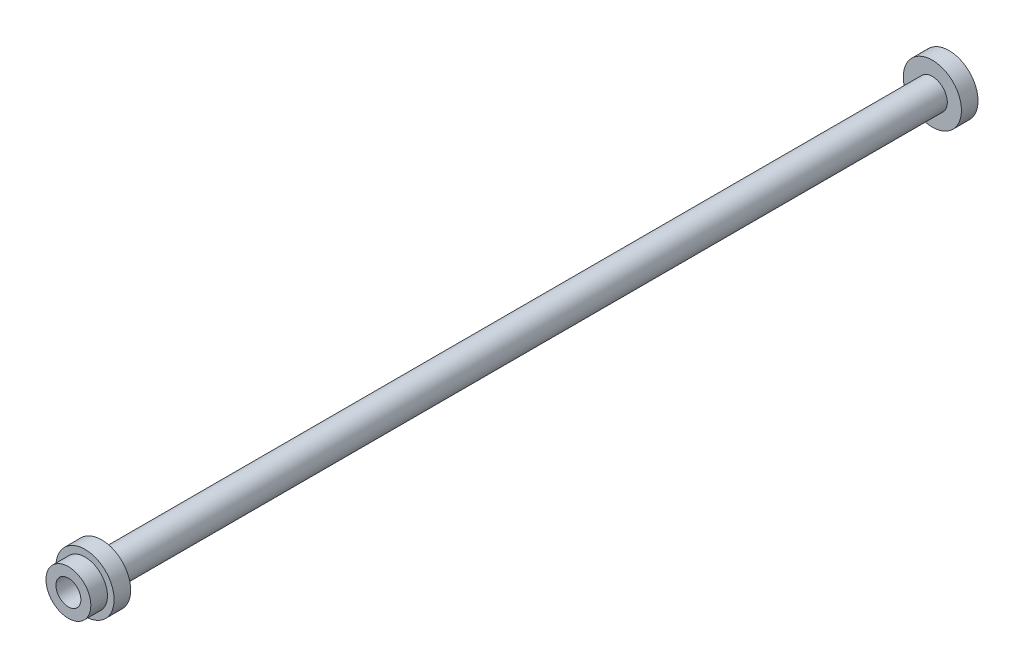
ISO-10303-21;
HEADER;
FILE_DESCRIPTION(('STEP AP214'),'2;1');
FILE_NAME('part.step','',(''),(''),'','','');
FILE_SCHEMA(('AUTOMOTIVE_DESIGN { 1 0 10303 214 1 1 1 1 }'));
ENDSEC;
DATA;
#1=APPLICATION_CONTEXT('core data for automotive mechanical design processes');
#2=APPLICATION_PROTOCOL_DEFINITION('international standard','automotive_design',2000,#1);
#3=PRODUCT_CONTEXT('',#1,'mechanical');
#4=PRODUCT('Part','Part','',(#3));
#5=PRODUCT_RELATED_PRODUCT_CATEGORY('part','',(#4));
#6=PRODUCT_DEFINITION_FORMATION('','',#4);
#7=PRODUCT_DEFINITION_CONTEXT('part definition',#1,'design');
#8=PRODUCT_DEFINITION('design','',#6,#7);
#9=PRODUCT_DEFINITION_SHAPE('','',#8);
#10=(LENGTH_UNIT() NAMED_UNIT(*) SI_UNIT(.MILLI.,.METRE.));
#11=(NAMED_UNIT(*) PLANE_ANGLE_UNIT() SI_UNIT($,.RADIAN.));
#12=(NAMED_UNIT(*) SI_UNIT($,.STERADIAN.) SOLID_ANGLE_UNIT());
#13=UNCERTAINTY_MEASURE_WITH_UNIT(LENGTH_MEASURE(1.E-05),#10,'distance_accuracy_value','');
#14=(GEOMETRIC_REPRESENTATION_CONTEXT(3) GLOBAL_UNCERTAINTY_ASSIGNED_CONTEXT((#13)) GLOBAL_UNIT_ASSIGNED_CONTEXT((#10,
#11,#12)) REPRESENTATION_CONTEXT('',''));
#15=CARTESIAN_POINT('',(0.,0.,0.));
#16=DIRECTION('',(0.,0.,1.));
#17=DIRECTION('',(1.,0.,0.));
#18=AXIS2_PLACEMENT_3D('',#15,#16,#17);
#19=CARTESIAN_POINT('',(0.,0.,530.));
#20=DIRECTION('',(0.,0.,1.));
#21=DIRECTION('',(1.,0.,0.));
#22=AXIS2_PLACEMENT_3D('',#19,#20,#21);
#23=PLANE('',#22);
#24=CARTESIAN_POINT('',(0.,0.,530.));
#25=DIRECTION('',(0.,0.,1.));
#26=DIRECTION('',(1.,0.,0.));
#27=AXIS2_PLACEMENT_3D('',#24,#25,#26);
#28=CIRCLE('',#27,7.50000000000001);
#29=CARTESIAN_POINT('',(7.50000000000001,0.,530.));
#30=VERTEX_POINT('',#29);
#31=EDGE_CURVE('E54',#30,#30,#28,.T.);
#32=ORIENTED_EDGE('',*,*,#31,.F.);
#33=EDGE_LOOP('',(#32));
#34=FACE_BOUND('',#33,.T.);
#35=CARTESIAN_POINT('',(0.,0.,530.));
#36=DIRECTION('',(0.,0.,1.));
#37=DIRECTION('',(1.,0.,0.));
#38=AXIS2_PLACEMENT_3D('',#35,#36,#37);
#39=CIRCLE('',#38,13.5);
#40=CARTESIAN_POINT('',(13.5,0.,530.));
#41=VERTEX_POINT('',#40);
#42=EDGE_CURVE('E100',#41,#41,#39,.T.);
#43=ORIENTED_EDGE('',*,*,#42,.T.);
#44=EDGE_LOOP('',(#43));
#45=FACE_BOUND('',#44,.T.);
#46=ADVANCED_FACE('F41',(#34,#45),#23,.T.);
#47=CARTESIAN_POINT('',(0.,0.,510.));
#48=DIRECTION('',(0.,0.,1.));
#49=DIRECTION('',(1.,0.,0.));
#50=AXIS2_PLACEMENT_3D('',#47,#48,#49);
#51=CYLINDRICAL_SURFACE('',#50,17.5);
#52=CARTESIAN_POINT('',(0.,0.,510.));
#53=DIRECTION('',(0.,0.,1.));
#54=DIRECTION('',(1.,0.,0.));
#55=AXIS2_PLACEMENT_3D('',#52,#53,#54);
#56=CIRCLE('',#55,17.5);
#57=CARTESIAN_POINT('',(17.5,0.,510.));
#58=VERTEX_POINT('',#57);
#59=EDGE_CURVE('E58',#58,#58,#56,.T.);
#60=ORIENTED_EDGE('',*,*,#59,.T.);
#61=EDGE_LOOP('',(#60));
#62=FACE_BOUND('',#61,.T.);
#63=CARTESIAN_POINT('',(0.,0.,520.));
#64=DIRECTION('',(0.,0.,1.));
#65=DIRECTION('',(1.,0.,0.));
#66=AXIS2_PLACEMENT_3D('',#63,#64,#65);
#67=CIRCLE('',#66,17.5);
#68=CARTESIAN_POINT('',(17.5,0.,520.));
#69=VERTEX_POINT('',#68);
#70=EDGE_CURVE('E105',#69,#69,#67,.T.);
#71=ORIENTED_EDGE('',*,*,#70,.F.);
#72=EDGE_LOOP('',(#71));
#73=FACE_BOUND('',#72,.T.);
#74=ADVANCED_FACE('F90',(#62,#73),#51,.T.);
#75=CARTESIAN_POINT('',(0.,0.,530.));
#76=DIRECTION('',(0.,0.,-1.));
#77=DIRECTION('',(-1.,0.,0.));
#78=AXIS2_PLACEMENT_3D('',#75,#76,#77);
#79=CYLINDRICAL_SURFACE('',#78,9.00000000000001);
#80=CARTESIAN_POINT('',(0.,0.,10.));
#81=DIRECTION('',(0.,0.,-1.));
#82=DIRECTION('',(-1.,0.,0.));
#83=AXIS2_PLACEMENT_3D('',#80,#81,#82);
#84=CIRCLE('',#83,9.00000000000001);
#85=CARTESIAN_POINT('',(-9.00000000000001,0.,10.));
#86=VERTEX_POINT('',#85);
#87=EDGE_CURVE('E49',#86,#86,#84,.T.);
#88=ORIENTED_EDGE('',*,*,#87,.F.);
#89=EDGE_LOOP('',(#88));
#90=FACE_BOUND('',#89,.T.);
#91=CARTESIAN_POINT('',(0.,0.,510.));
#92=DIRECTION('',(0.,0.,1.));
#93=DIRECTION('',(1.,0.,0.));
#94=AXIS2_PLACEMENT_3D('',#91,#92,#93);
#95=CIRCLE('',#94,9.00000000000001);
#96=CARTESIAN_POINT('',(9.00000000000001,0.,510.));
#97=VERTEX_POINT('',#96);
#98=EDGE_CURVE('E10',#97,#97,#95,.T.);
#99=ORIENTED_EDGE('',*,*,#98,.F.);
#100=EDGE_LOOP('',(#99));
#101=FACE_BOUND('',#100,.T.);
#102=ADVANCED_FACE('F43',(#90,#101),#79,.T.);
#103=CARTESIAN_POINT('',(0.,0.,0.));
#104=DIRECTION('',(0.,0.,1.));
#105=DIRECTION('',(1.,0.,0.));
#106=AXIS2_PLACEMENT_3D('',#103,#104,#105);
#107=PLANE('',#106);
#108=CARTESIAN_POINT('',(0.,0.,0.));
#109=DIRECTION('',(0.,0.,1.));
#110=DIRECTION('',(1.,0.,0.));
#111=AXIS2_PLACEMENT_3D('',#108,#109,#110);
#112=CIRCLE('',#111,7.50000000000001);
#113=CARTESIAN_POINT('',(7.50000000000001,0.,0.));
#114=VERTEX_POINT('',#113);
#115=EDGE_CURVE('E45',#114,#114,#112,.T.);
#116=ORIENTED_EDGE('',*,*,#115,.T.);
#117=EDGE_LOOP('',(#116));
#118=FACE_BOUND('',#117,.T.);
#119=CARTESIAN_POINT('',(0.,0.,0.));
#120=DIRECTION('',(0.,0.,-1.));
#121=DIRECTION('',(-1.,0.,0.));
#122=AXIS2_PLACEMENT_3D('',#119,#120,#121);
#123=CIRCLE('',#122,17.5);
#124=CARTESIAN_POINT('',(-17.5,0.,0.));
#125=VERTEX_POINT('',#124);
#126=EDGE_CURVE('E63',#125,#125,#123,.T.);
#127=ORIENTED_EDGE('',*,*,#126,.T.);
#128=EDGE_LOOP('',(#127));
#129=FACE_BOUND('',#128,.T.);
#130=ADVANCED_FACE('F71',(#118,#129),#107,.F.);
#131=CARTESIAN_POINT('',(0.,0.,530.));
#132=DIRECTION('',(0.,0.,-1.));
#133=DIRECTION('',(-1.,0.,0.));
#134=AXIS2_PLACEMENT_3D('',#131,#132,#133);
#135=CYLINDRICAL_SURFACE('',#134,7.50000000000001);
#136=ORIENTED_EDGE('',*,*,#31,.T.);
#137=EDGE_LOOP('',(#136));
#138=FACE_BOUND('',#137,.T.);
#139=ORIENTED_EDGE('',*,*,#115,.F.);
#140=EDGE_LOOP('',(#139));
#141=FACE_BOUND('',#140,.T.);
#142=ADVANCED_FACE('F74',(#138,#141),#135,.F.);
#143=CARTESIAN_POINT('',(0.,0.,10.));
#144=DIRECTION('',(0.,0.,-1.));
#145=DIRECTION('',(-1.,0.,0.));
#146=AXIS2_PLACEMENT_3D('',#143,#144,#145);
#147=PLANE('',#146);
#148=CARTESIAN_POINT('',(0.,0.,10.));
#149=DIRECTION('',(0.,0.,-1.));
#150=DIRECTION('',(-1.,0.,0.));
#151=AXIS2_PLACEMENT_3D('',#148,#149,#150);
#152=CIRCLE('',#151,17.5);
#153=CARTESIAN_POINT('',(-17.5,0.,10.));
#154=VERTEX_POINT('',#153);
#155=EDGE_CURVE('E60',#154,#154,#152,.T.);
#156=ORIENTED_EDGE('',*,*,#155,.F.);
#157=EDGE_LOOP('',(#156));
#158=FACE_BOUND('',#157,.T.);
#159=ORIENTED_EDGE('',*,*,#87,.T.);
#160=EDGE_LOOP('',(#159));
#161=FACE_BOUND('',#160,.T.);
#162=ADVANCED_FACE('F76',(#158,#161),#147,.F.);
#163=CARTESIAN_POINT('',(0.,0.,10.));
#164=DIRECTION('',(0.,0.,-1.));
#165=DIRECTION('',(-1.,0.,0.));
#166=AXIS2_PLACEMENT_3D('',#163,#164,#165);
#167=CYLINDRICAL_SURFACE('',#166,17.5);
#168=ORIENTED_EDGE('',*,*,#155,.T.);
#169=EDGE_LOOP('',(#168));
#170=FACE_BOUND('',#169,.T.);
#171=ORIENTED_EDGE('',*,*,#126,.F.);
#172=EDGE_LOOP('',(#171));
#173=FACE_BOUND('',#172,.T.);
#174=ADVANCED_FACE('F83',(#170,#173),#167,.T.);
#175=CARTESIAN_POINT('',(0.,0.,510.));
#176=DIRECTION('',(0.,0.,1.));
#177=DIRECTION('',(1.,0.,0.));
#178=AXIS2_PLACEMENT_3D('',#175,#176,#177);
#179=PLANE('',#178);
#180=ORIENTED_EDGE('',*,*,#59,.F.);
#181=EDGE_LOOP('',(#180));
#182=FACE_BOUND('',#181,.T.);
#183=ORIENTED_EDGE('',*,*,#98,.T.);
#184=EDGE_LOOP('',(#183));
#185=FACE_BOUND('',#184,.T.);
#186=ADVANCED_FACE('F114',(#182,#185),#179,.F.);
#187=CARTESIAN_POINT('',(0.,0.,520.));
#188=DIRECTION('',(0.,0.,1.));
#189=DIRECTION('',(1.,0.,0.));
#190=AXIS2_PLACEMENT_3D('',#187,#188,#189);
#191=PLANE('',#190);
#192=CARTESIAN_POINT('',(0.,0.,520.));
#193=DIRECTION('',(0.,0.,1.));
#194=DIRECTION('',(1.,0.,0.));
#195=AXIS2_PLACEMENT_3D('',#192,#193,#194);
#196=CIRCLE('',#195,13.5);
#197=CARTESIAN_POINT('',(13.5,0.,520.));
#198=VERTEX_POINT('',#197);
#199=EDGE_CURVE('E102',#198,#198,#196,.T.);
#200=ORIENTED_EDGE('',*,*,#199,.F.);
#201=EDGE_LOOP('',(#200));
#202=FACE_BOUND('',#201,.T.);
#203=ORIENTED_EDGE('',*,*,#70,.T.);
#204=EDGE_LOOP('',(#203));
#205=FACE_BOUND('',#204,.T.);
#206=ADVANCED_FACE('F115',(#202,#205),#191,.T.);
#207=CARTESIAN_POINT('',(0.,0.,520.));
#208=DIRECTION('',(0.,0.,1.));
#209=DIRECTION('',(1.,0.,0.));
#210=AXIS2_PLACEMENT_3D('',#207,#208,#209);
#211=CYLINDRICAL_SURFACE('',#210,13.5);
#212=ORIENTED_EDGE('',*,*,#199,.T.);
#213=EDGE_LOOP('',(#212));
#214=FACE_BOUND('',#213,.T.);
#215=ORIENTED_EDGE('',*,*,#42,.F.);
#216=EDGE_LOOP('',(#215));
#217=FACE_BOUND('',#216,.T.);
#218=ADVANCED_FACE('F120',(#214,#217),#211,.T.);
#219=CLOSED_SHELL('',(#46,#74,#102,#130,#142,#162,#174,#186,#206,#218));
#220=MANIFOLD_SOLID_BREP('B2',#219);
#221=ADVANCED_BREP_SHAPE_REPRESENTATION('',(#18,#220),#14);
#222=SHAPE_DEFINITION_REPRESENTATION(#9,#221);
ENDSEC;
END-ISO-10303-21;
